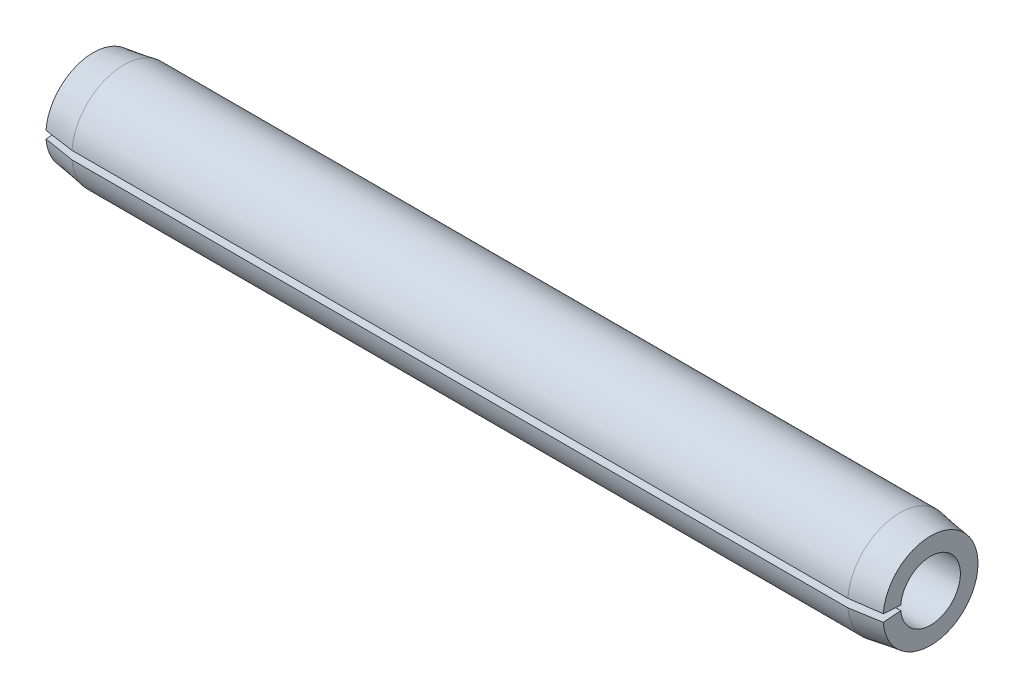
ISO-10303-21;
HEADER;
FILE_DESCRIPTION(('STEP AP214'),'2;1');
FILE_NAME('part.step','',(''),(''),'','','');
FILE_SCHEMA(('AUTOMOTIVE_DESIGN { 1 0 10303 214 1 1 1 1 }'));
ENDSEC;
DATA;
#1=APPLICATION_CONTEXT('core data for automotive mechanical design processes');
#2=APPLICATION_PROTOCOL_DEFINITION('international standard','automotive_design',2000,#1);
#3=PRODUCT_CONTEXT('',#1,'mechanical');
#4=PRODUCT('Part','Part','',(#3));
#5=PRODUCT_RELATED_PRODUCT_CATEGORY('part','',(#4));
#6=PRODUCT_DEFINITION_FORMATION('','',#4);
#7=PRODUCT_DEFINITION_CONTEXT('part definition',#1,'design');
#8=PRODUCT_DEFINITION('design','',#6,#7);
#9=PRODUCT_DEFINITION_SHAPE('','',#8);
#10=(LENGTH_UNIT() NAMED_UNIT(*) SI_UNIT(.MILLI.,.METRE.));
#11=(NAMED_UNIT(*) PLANE_ANGLE_UNIT() SI_UNIT($,.RADIAN.));
#12=(NAMED_UNIT(*) SI_UNIT($,.STERADIAN.) SOLID_ANGLE_UNIT());
#13=UNCERTAINTY_MEASURE_WITH_UNIT(LENGTH_MEASURE(1.E-05),#10,'distance_accuracy_value','');
#14=(GEOMETRIC_REPRESENTATION_CONTEXT(3) GLOBAL_UNCERTAINTY_ASSIGNED_CONTEXT((#13)) GLOBAL_UNIT_ASSIGNED_CONTEXT((#10,
#11,#12)) REPRESENTATION_CONTEXT('',''));
#15=CARTESIAN_POINT('',(0.,0.,0.));
#16=DIRECTION('',(0.,0.,1.));
#17=DIRECTION('',(1.,0.,0.));
#18=AXIS2_PLACEMENT_3D('',#15,#16,#17);
#19=CARTESIAN_POINT('',(0.,2.159,0.));
#20=DIRECTION('',(1.,0.,0.));
#21=DIRECTION('',(0.,0.,-1.));
#22=AXIS2_PLACEMENT_3D('',#19,#20,#21);
#23=PLANE('',#22);
#24=DIRECTION('',(0.,0.0784590957278456,0.996917333733128));
#25=VECTOR('',#24,1.);
#26=CARTESIAN_POINT('',(0.,0.,0.));
#27=LINE('',#26,#25);
#28=CARTESIAN_POINT('',(0.,0.106618065184569,1.35471096480995));
#29=VERTEX_POINT('',#28);
#30=CARTESIAN_POINT('',(0.,0.169393187676419,2.15234452352982));
#31=VERTEX_POINT('',#30);
#32=EDGE_CURVE('E81',#29,#31,#27,.T.);
#33=ORIENTED_EDGE('',*,*,#32,.T.);
#34=CARTESIAN_POINT('',(0.,0.,0.));
#35=DIRECTION('',(-1.,0.,0.));
#36=DIRECTION('',(0.,0.,1.));
#37=AXIS2_PLACEMENT_3D('',#34,#35,#36);
#38=CIRCLE('',#37,2.159);
#39=CARTESIAN_POINT('',(0.,-0.169393187676419,2.15234452352982));
#40=VERTEX_POINT('',#39);
#41=EDGE_CURVE('E99',#31,#40,#38,.T.);
#42=ORIENTED_EDGE('',*,*,#41,.T.);
#43=DIRECTION('',(0.,-0.0784590957278456,0.996917333733128));
#44=VECTOR('',#43,1.);
#45=CARTESIAN_POINT('',(0.,0.,0.));
#46=LINE('',#45,#44);
#47=CARTESIAN_POINT('',(0.,-0.106618065184569,1.35471096480995));
#48=VERTEX_POINT('',#47);
#49=EDGE_CURVE('E53',#48,#40,#46,.T.);
#50=ORIENTED_EDGE('',*,*,#49,.F.);
#51=CARTESIAN_POINT('',(0.,0.,0.));
#52=DIRECTION('',(-1.,0.,0.));
#53=DIRECTION('',(0.,0.,1.));
#54=AXIS2_PLACEMENT_3D('',#51,#52,#53);
#55=CIRCLE('',#54,1.3589);
#56=EDGE_CURVE('E96',#29,#48,#55,.T.);
#57=ORIENTED_EDGE('',*,*,#56,.F.);
#58=EDGE_LOOP('',(#33,#42,#50,#57));
#59=FACE_BOUND('',#58,.T.);
#60=ADVANCED_FACE('F32',(#59),#23,.F.);
#61=CARTESIAN_POINT('',(-9.52499999999999,0.,0.));
#62=DIRECTION('',(-1.,0.,0.));
#63=DIRECTION('',(0.,0.,1.));
#64=AXIS2_PLACEMENT_3D('',#61,#62,#63);
#65=CYLINDRICAL_SURFACE('',#64,1.3589);
#66=DIRECTION('',(-1.,0.,0.));
#67=VECTOR('',#66,1.);
#68=CARTESIAN_POINT('',(-9.52499999999999,0.106618065184569,1.35471096480995));
#69=LINE('',#68,#67);
#70=CARTESIAN_POINT('',(38.1,0.106618065184569,1.35471096480995));
#71=VERTEX_POINT('',#70);
#72=EDGE_CURVE('E84',#29,#71,#69,.F.);
#73=ORIENTED_EDGE('',*,*,#72,.F.);
#74=ORIENTED_EDGE('',*,*,#56,.T.);
#75=DIRECTION('',(-1.,0.,0.));
#76=VECTOR('',#75,1.);
#77=CARTESIAN_POINT('',(-9.52499999999999,-0.106618065184569,1.35471096480995));
#78=LINE('',#77,#76);
#79=CARTESIAN_POINT('',(38.1,-0.106618065184569,1.35471096480995));
#80=VERTEX_POINT('',#79);
#81=EDGE_CURVE('E117',#48,#80,#78,.F.);
#82=ORIENTED_EDGE('',*,*,#81,.T.);
#83=CARTESIAN_POINT('',(38.1,0.,0.));
#84=DIRECTION('',(-1.,0.,0.));
#85=DIRECTION('',(0.,0.,1.));
#86=AXIS2_PLACEMENT_3D('',#83,#84,#85);
#87=CIRCLE('',#86,1.3589);
#88=EDGE_CURVE('E98',#71,#80,#87,.T.);
#89=ORIENTED_EDGE('',*,*,#88,.F.);
#90=EDGE_LOOP('',(#73,#74,#82,#89));
#91=FACE_BOUND('',#90,.T.);
#92=ADVANCED_FACE('F94',(#91),#65,.F.);
#93=CARTESIAN_POINT('',(38.1,1.3589,0.));
#94=DIRECTION('',(-1.,0.,0.));
#95=DIRECTION('',(0.,0.,1.));
#96=AXIS2_PLACEMENT_3D('',#93,#94,#95);
#97=PLANE('',#96);
#98=DIRECTION('',(0.,0.0784590957278456,0.996917333733128));
#99=VECTOR('',#98,1.);
#100=CARTESIAN_POINT('',(38.1,0.,0.));
#101=LINE('',#100,#99);
#102=CARTESIAN_POINT('',(38.1,0.169393187676419,2.15234452352982));
#103=VERTEX_POINT('',#102);
#104=EDGE_CURVE('E126',#71,#103,#101,.T.);
#105=ORIENTED_EDGE('',*,*,#104,.F.);
#106=ORIENTED_EDGE('',*,*,#88,.T.);
#107=DIRECTION('',(0.,-0.0784590957278456,0.996917333733128));
#108=VECTOR('',#107,1.);
#109=CARTESIAN_POINT('',(38.1,0.,0.));
#110=LINE('',#109,#108);
#111=CARTESIAN_POINT('',(38.1,-0.169393187676419,2.15234452352982));
#112=VERTEX_POINT('',#111);
#113=EDGE_CURVE('E125',#80,#112,#110,.T.);
#114=ORIENTED_EDGE('',*,*,#113,.T.);
#115=CARTESIAN_POINT('',(38.1,0.,0.));
#116=DIRECTION('',(-1.,0.,0.));
#117=DIRECTION('',(0.,0.,1.));
#118=AXIS2_PLACEMENT_3D('',#115,#116,#117);
#119=CIRCLE('',#118,2.159);
#120=EDGE_CURVE('E103',#103,#112,#119,.T.);
#121=ORIENTED_EDGE('',*,*,#120,.F.);
#122=EDGE_LOOP('',(#105,#106,#114,#121));
#123=FACE_BOUND('',#122,.T.);
#124=ADVANCED_FACE('F136',(#123),#97,.F.);
#125=CARTESIAN_POINT('',(38.1,0.,0.));
#126=DIRECTION('',(-1.,0.,0.));
#127=DIRECTION('',(0.,0.,1.));
#128=AXIS2_PLACEMENT_3D('',#125,#126,#127);
#129=CONICAL_SURFACE('',#128,2.159,0.153332388398326);
#130=DIRECTION('',(-0.988267602905191,0.011983235471256,0.152261443299569));
#131=VECTOR('',#130,1.);
#132=CARTESIAN_POINT('',(52.0699999999997,0.,0.));
#133=LINE('',#132,#131);
#134=CARTESIAN_POINT('',(36.703,0.186332506444061,2.36757897588281));
#135=VERTEX_POINT('',#134);
#136=EDGE_CURVE('E100',#103,#135,#133,.T.);
#137=ORIENTED_EDGE('',*,*,#136,.F.);
#138=ORIENTED_EDGE('',*,*,#120,.T.);
#139=DIRECTION('',(-0.988267602905191,-0.011983235471256,0.152261443299569));
#140=VECTOR('',#139,1.);
#141=CARTESIAN_POINT('',(52.0699999999997,0.,0.));
#142=LINE('',#141,#140);
#143=CARTESIAN_POINT('',(36.703,-0.186332506444061,2.36757897588281));
#144=VERTEX_POINT('',#143);
#145=EDGE_CURVE('E119',#112,#144,#142,.T.);
#146=ORIENTED_EDGE('',*,*,#145,.T.);
#147=CARTESIAN_POINT('',(36.703,0.,0.));
#148=DIRECTION('',(-1.,0.,0.));
#149=DIRECTION('',(0.,0.,1.));
#150=AXIS2_PLACEMENT_3D('',#147,#148,#149);
#151=CIRCLE('',#150,2.3749);
#152=EDGE_CURVE('E108',#135,#144,#151,.T.);
#153=ORIENTED_EDGE('',*,*,#152,.F.);
#154=EDGE_LOOP('',(#137,#138,#146,#153));
#155=FACE_BOUND('',#154,.T.);
#156=ADVANCED_FACE('F135',(#155),#129,.T.);
#157=CARTESIAN_POINT('',(-9.52499999999999,0.,0.));
#158=DIRECTION('',(-1.,0.,0.));
#159=DIRECTION('',(0.,0.,1.));
#160=AXIS2_PLACEMENT_3D('',#157,#158,#159);
#161=CYLINDRICAL_SURFACE('',#160,2.3749);
#162=DIRECTION('',(-1.,0.,0.));
#163=VECTOR('',#162,1.);
#164=CARTESIAN_POINT('',(-9.52499999999999,0.186332506444061,2.36757897588281));
#165=LINE('',#164,#163);
#166=CARTESIAN_POINT('',(1.397,0.186332506444061,2.36757897588281));
#167=VERTEX_POINT('',#166);
#168=EDGE_CURVE('E45',#135,#167,#165,.T.);
#169=ORIENTED_EDGE('',*,*,#168,.F.);
#170=ORIENTED_EDGE('',*,*,#152,.T.);
#171=DIRECTION('',(-1.,0.,0.));
#172=VECTOR('',#171,1.);
#173=CARTESIAN_POINT('',(-9.52499999999999,-0.186332506444061,2.36757897588281));
#174=LINE('',#173,#172);
#175=CARTESIAN_POINT('',(1.397,-0.186332506444061,2.36757897588281));
#176=VERTEX_POINT('',#175);
#177=EDGE_CURVE('E122',#144,#176,#174,.T.);
#178=ORIENTED_EDGE('',*,*,#177,.T.);
#179=CARTESIAN_POINT('',(1.397,0.,0.));
#180=DIRECTION('',(-1.,0.,0.));
#181=DIRECTION('',(0.,0.,1.));
#182=AXIS2_PLACEMENT_3D('',#179,#180,#181);
#183=CIRCLE('',#182,2.3749);
#184=EDGE_CURVE('E111',#167,#176,#183,.T.);
#185=ORIENTED_EDGE('',*,*,#184,.F.);
#186=EDGE_LOOP('',(#169,#170,#178,#185));
#187=FACE_BOUND('',#186,.T.);
#188=ADVANCED_FACE('F139',(#187),#161,.T.);
#189=CARTESIAN_POINT('',(1.397,0.,0.));
#190=DIRECTION('',(1.,0.,0.));
#191=DIRECTION('',(0.,0.,-1.));
#192=AXIS2_PLACEMENT_3D('',#189,#190,#191);
#193=CONICAL_SURFACE('',#192,2.3749,0.153332388398323);
#194=DIRECTION('',(-0.988267602905192,-0.0119832354712558,-0.152261443299566));
#195=VECTOR('',#194,1.);
#196=CARTESIAN_POINT('',(-13.97,0.,0.));
#197=LINE('',#196,#195);
#198=EDGE_CURVE('E11',#167,#31,#197,.T.);
#199=ORIENTED_EDGE('',*,*,#198,.F.);
#200=ORIENTED_EDGE('',*,*,#184,.T.);
#201=DIRECTION('',(-0.988267602905192,0.0119832354712558,-0.152261443299566));
#202=VECTOR('',#201,1.);
#203=CARTESIAN_POINT('',(-13.97,0.,0.));
#204=LINE('',#203,#202);
#205=EDGE_CURVE('E39',#176,#40,#204,.T.);
#206=ORIENTED_EDGE('',*,*,#205,.T.);
#207=ORIENTED_EDGE('',*,*,#41,.F.);
#208=EDGE_LOOP('',(#199,#200,#206,#207));
#209=FACE_BOUND('',#208,.T.);
#210=ADVANCED_FACE('F142',(#209),#193,.T.);
#211=CARTESIAN_POINT('',(38.1,0.,0.));
#212=DIRECTION('',(0.,-0.996917333733128,-0.0784590957278456));
#213=DIRECTION('',(0.,0.0784590957278456,-0.996917333733128));
#214=AXIS2_PLACEMENT_3D('',#211,#212,#213);
#215=PLANE('',#214);
#216=ORIENTED_EDGE('',*,*,#49,.T.);
#217=ORIENTED_EDGE('',*,*,#205,.F.);
#218=ORIENTED_EDGE('',*,*,#177,.F.);
#219=ORIENTED_EDGE('',*,*,#145,.F.);
#220=ORIENTED_EDGE('',*,*,#113,.F.);
#221=ORIENTED_EDGE('',*,*,#81,.F.);
#222=EDGE_LOOP('',(#216,#217,#218,#219,#220,#221));
#223=FACE_BOUND('',#222,.T.);
#224=ADVANCED_FACE('F137',(#223),#215,.F.);
#225=CARTESIAN_POINT('',(38.1,0.,0.));
#226=DIRECTION('',(0.,-0.996917333733128,0.0784590957278456));
#227=DIRECTION('',(0.,-0.0784590957278456,-0.996917333733128));
#228=AXIS2_PLACEMENT_3D('',#225,#226,#227);
#229=PLANE('',#228);
#230=ORIENTED_EDGE('',*,*,#72,.T.);
#231=ORIENTED_EDGE('',*,*,#104,.T.);
#232=ORIENTED_EDGE('',*,*,#136,.T.);
#233=ORIENTED_EDGE('',*,*,#168,.T.);
#234=ORIENTED_EDGE('',*,*,#198,.T.);
#235=ORIENTED_EDGE('',*,*,#32,.F.);
#236=EDGE_LOOP('',(#230,#231,#232,#233,#234,#235));
#237=FACE_BOUND('',#236,.T.);
#238=ADVANCED_FACE('F83',(#237),#229,.T.);
#239=CLOSED_SHELL('',(#60,#92,#124,#156,#188,#210,#224,#238));
#240=MANIFOLD_SOLID_BREP('B2',#239);
#241=ADVANCED_BREP_SHAPE_REPRESENTATION('',(#18,#240),#14);
#242=SHAPE_DEFINITION_REPRESENTATION(#9,#241);
ENDSEC;
END-ISO-10303-21;
